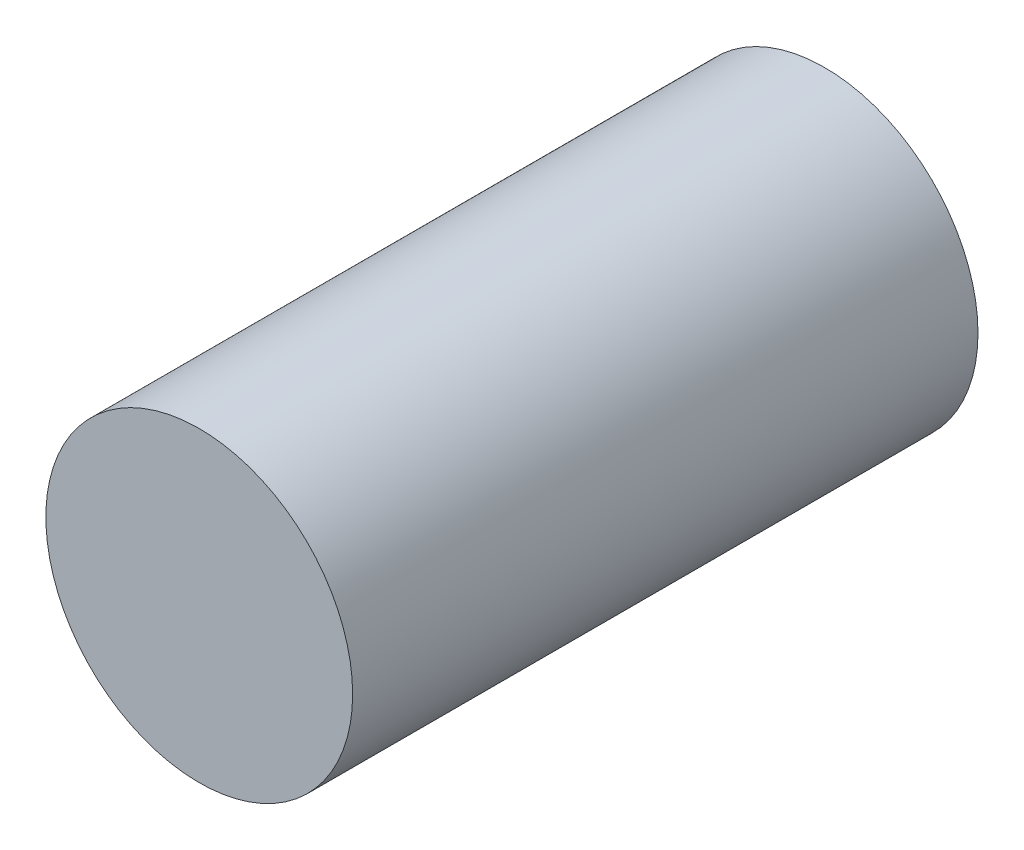
ISO-10303-21;
HEADER;
FILE_DESCRIPTION(('STEP AP214'),'2;1');
FILE_NAME('part.step','',(''),(''),'','','');
FILE_SCHEMA(('AUTOMOTIVE_DESIGN { 1 0 10303 214 1 1 1 1 }'));
ENDSEC;
DATA;
#1=APPLICATION_CONTEXT('core data for automotive mechanical design processes');
#2=APPLICATION_PROTOCOL_DEFINITION('international standard','automotive_design',2000,#1);
#3=PRODUCT_CONTEXT('',#1,'mechanical');
#4=PRODUCT('Part','Part','',(#3));
#5=PRODUCT_RELATED_PRODUCT_CATEGORY('part','',(#4));
#6=PRODUCT_DEFINITION_FORMATION('','',#4);
#7=PRODUCT_DEFINITION_CONTEXT('part definition',#1,'design');
#8=PRODUCT_DEFINITION('design','',#6,#7);
#9=PRODUCT_DEFINITION_SHAPE('','',#8);
#10=(LENGTH_UNIT() NAMED_UNIT(*) SI_UNIT(.MILLI.,.METRE.));
#11=(NAMED_UNIT(*) PLANE_ANGLE_UNIT() SI_UNIT($,.RADIAN.));
#12=(NAMED_UNIT(*) SI_UNIT($,.STERADIAN.) SOLID_ANGLE_UNIT());
#13=UNCERTAINTY_MEASURE_WITH_UNIT(LENGTH_MEASURE(1.E-05),#10,'distance_accuracy_value','');
#14=(GEOMETRIC_REPRESENTATION_CONTEXT(3) GLOBAL_UNCERTAINTY_ASSIGNED_CONTEXT((#13)) GLOBAL_UNIT_ASSIGNED_CONTEXT((#10,
#11,#12)) REPRESENTATION_CONTEXT('',''));
#15=CARTESIAN_POINT('',(0.,0.,0.));
#16=DIRECTION('',(0.,0.,1.));
#17=DIRECTION('',(1.,0.,0.));
#18=AXIS2_PLACEMENT_3D('',#15,#16,#17);
#19=CARTESIAN_POINT('',(0.,0.,26.5));
#20=DIRECTION('',(0.,0.,-1.));
#21=DIRECTION('',(-1.,0.,0.));
#22=AXIS2_PLACEMENT_3D('',#19,#20,#21);
#23=CYLINDRICAL_SURFACE('',#22,6.5);
#24=CARTESIAN_POINT('',(0.,0.,26.5));
#25=DIRECTION('',(0.,0.,1.));
#26=DIRECTION('',(1.,0.,0.));
#27=AXIS2_PLACEMENT_3D('',#24,#25,#26);
#28=CIRCLE('',#27,6.5);
#29=CARTESIAN_POINT('',(6.5,0.,26.5));
#30=VERTEX_POINT('',#29);
#31=EDGE_CURVE('E12',#30,#30,#28,.T.);
#32=ORIENTED_EDGE('',*,*,#31,.F.);
#33=EDGE_LOOP('',(#32));
#34=FACE_BOUND('',#33,.T.);
#35=CARTESIAN_POINT('',(0.,0.,0.));
#36=DIRECTION('',(0.,0.,1.));
#37=DIRECTION('',(1.,0.,0.));
#38=AXIS2_PLACEMENT_3D('',#35,#36,#37);
#39=CIRCLE('',#38,6.5);
#40=CARTESIAN_POINT('',(6.5,0.,0.));
#41=VERTEX_POINT('',#40);
#42=EDGE_CURVE('E45',#41,#41,#39,.T.);
#43=ORIENTED_EDGE('',*,*,#42,.T.);
#44=EDGE_LOOP('',(#43));
#45=FACE_BOUND('',#44,.T.);
#46=ADVANCED_FACE('F42',(#34,#45),#23,.T.);
#47=CARTESIAN_POINT('',(0.,0.,26.5));
#48=DIRECTION('',(0.,0.,1.));
#49=DIRECTION('',(1.,0.,0.));
#50=AXIS2_PLACEMENT_3D('',#47,#48,#49);
#51=PLANE('',#50);
#52=ORIENTED_EDGE('',*,*,#31,.T.);
#53=EDGE_LOOP('',(#52));
#54=FACE_BOUND('',#53,.T.);
#55=ADVANCED_FACE('F57',(#54),#51,.T.);
#56=CARTESIAN_POINT('',(0.,0.,0.));
#57=DIRECTION('',(0.,0.,1.));
#58=DIRECTION('',(1.,0.,0.));
#59=AXIS2_PLACEMENT_3D('',#56,#57,#58);
#60=PLANE('',#59);
#61=ORIENTED_EDGE('',*,*,#42,.F.);
#62=EDGE_LOOP('',(#61));
#63=FACE_BOUND('',#62,.T.);
#64=ADVANCED_FACE('F55',(#63),#60,.F.);
#65=CLOSED_SHELL('',(#46,#55,#64));
#66=MANIFOLD_SOLID_BREP('B2',#65);
#67=ADVANCED_BREP_SHAPE_REPRESENTATION('',(#18,#66),#14);
#68=SHAPE_DEFINITION_REPRESENTATION(#9,#67);
ENDSEC;
END-ISO-10303-21;
